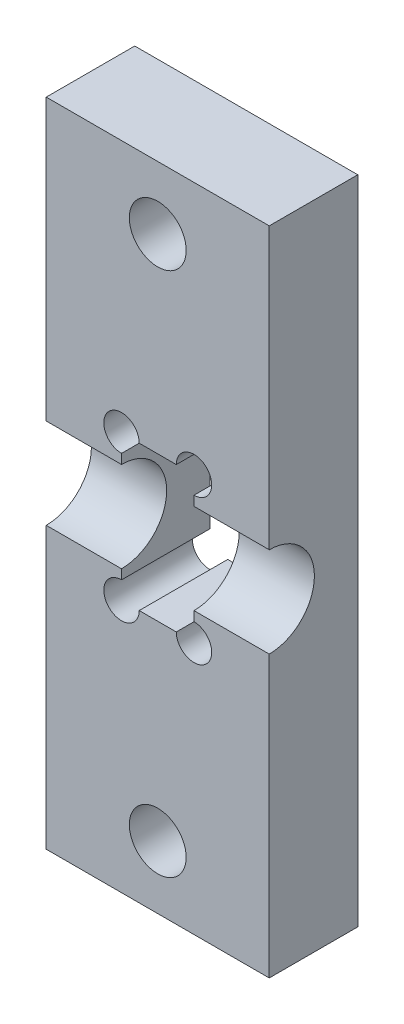
ISO-10303-21;
HEADER;
FILE_DESCRIPTION(('STEP AP214'),'2;1');
FILE_NAME('part.step','',(''),(''),'','','');
FILE_SCHEMA(('AUTOMOTIVE_DESIGN { 1 0 10303 214 1 1 1 1 }'));
ENDSEC;
DATA;
#1=APPLICATION_CONTEXT('core data for automotive mechanical design processes');
#2=APPLICATION_PROTOCOL_DEFINITION('international standard','automotive_design',2000,#1);
#3=PRODUCT_CONTEXT('',#1,'mechanical');
#4=PRODUCT('Part','Part','',(#3));
#5=PRODUCT_RELATED_PRODUCT_CATEGORY('part','',(#4));
#6=PRODUCT_DEFINITION_FORMATION('','',#4);
#7=PRODUCT_DEFINITION_CONTEXT('part definition',#1,'design');
#8=PRODUCT_DEFINITION('design','',#6,#7);
#9=PRODUCT_DEFINITION_SHAPE('','',#8);
#10=(LENGTH_UNIT() NAMED_UNIT(*) SI_UNIT(.MILLI.,.METRE.));
#11=(NAMED_UNIT(*) PLANE_ANGLE_UNIT() SI_UNIT($,.RADIAN.));
#12=(NAMED_UNIT(*) SI_UNIT($,.STERADIAN.) SOLID_ANGLE_UNIT());
#13=UNCERTAINTY_MEASURE_WITH_UNIT(LENGTH_MEASURE(1.E-05),#10,'distance_accuracy_value','');
#14=(GEOMETRIC_REPRESENTATION_CONTEXT(3) GLOBAL_UNCERTAINTY_ASSIGNED_CONTEXT((#13)) GLOBAL_UNIT_ASSIGNED_CONTEXT((#10,
#11,#12)) REPRESENTATION_CONTEXT('',''));
#15=CARTESIAN_POINT('',(0.,0.,0.));
#16=DIRECTION('',(0.,0.,1.));
#17=DIRECTION('',(1.,0.,0.));
#18=AXIS2_PLACEMENT_3D('',#15,#16,#17);
#19=CARTESIAN_POINT('',(0.,0.,7.9375));
#20=DIRECTION('',(0.,0.,-1.));
#21=DIRECTION('',(-1.,0.,0.));
#22=AXIS2_PLACEMENT_3D('',#19,#20,#21);
#23=PLANE('',#22);
#24=CARTESIAN_POINT('',(9.99999999999999,52.78,7.9375));
#25=DIRECTION('',(0.,0.,1.));
#26=DIRECTION('',(1.,0.,0.));
#27=AXIS2_PLACEMENT_3D('',#24,#25,#26);
#28=CIRCLE('',#27,2.54999999999999);
#29=CARTESIAN_POINT('',(12.55,52.78,7.9375));
#30=VERTEX_POINT('',#29);
#31=EDGE_CURVE('E183',#30,#30,#28,.T.);
#32=ORIENTED_EDGE('',*,*,#31,.F.);
#33=EDGE_LOOP('',(#32));
#34=FACE_BOUND('',#33,.T.);
#35=DIRECTION('',(0.,-1.,0.));
#36=VECTOR('',#35,1.);
#37=CARTESIAN_POINT('',(0.,0.,7.9375));
#38=LINE('',#37,#36);
#39=CARTESIAN_POINT('',(0.,58.42,7.9375));
#40=VERTEX_POINT('',#39);
#41=CARTESIAN_POINT('',(0.,33.26,7.9375));
#42=VERTEX_POINT('',#41);
#43=EDGE_CURVE('E157',#40,#42,#38,.T.);
#44=ORIENTED_EDGE('',*,*,#43,.T.);
#45=DIRECTION('',(1.,0.,0.));
#46=VECTOR('',#45,1.);
#47=CARTESIAN_POINT('',(0.,33.26,7.9375));
#48=LINE('',#47,#46);
#49=CARTESIAN_POINT('',(6.74999999999999,33.26,7.9375));
#50=VERTEX_POINT('',#49);
#51=EDGE_CURVE('E143',#42,#50,#48,.T.);
#52=ORIENTED_EDGE('',*,*,#51,.T.);
#53=DIRECTION('',(0.,-1.,0.));
#54=VECTOR('',#53,1.);
#55=CARTESIAN_POINT('',(6.74999999999999,34.1225,7.9375));
#56=LINE('',#55,#54);
#57=CARTESIAN_POINT('',(6.74999999999999,34.1225,7.9375));
#58=VERTEX_POINT('',#57);
#59=EDGE_CURVE('E301',#58,#50,#56,.T.);
#60=ORIENTED_EDGE('',*,*,#59,.F.);
#61=CARTESIAN_POINT('',(6.74999999999999,35.71,7.9375));
#62=DIRECTION('',(0.,0.,1.));
#63=DIRECTION('',(-1.,0.,0.));
#64=AXIS2_PLACEMENT_3D('',#61,#62,#63);
#65=CIRCLE('',#64,1.5875);
#66=CARTESIAN_POINT('',(8.33749999999999,35.71,7.9375));
#67=VERTEX_POINT('',#66);
#68=EDGE_CURVE('E304',#67,#58,#65,.T.);
#69=ORIENTED_EDGE('',*,*,#68,.F.);
#70=DIRECTION('',(-1.,0.,0.));
#71=VECTOR('',#70,1.);
#72=CARTESIAN_POINT('',(11.6625,35.71,7.9375));
#73=LINE('',#72,#71);
#74=CARTESIAN_POINT('',(11.6625,35.71,7.9375));
#75=VERTEX_POINT('',#74);
#76=EDGE_CURVE('E306',#75,#67,#73,.T.);
#77=ORIENTED_EDGE('',*,*,#76,.F.);
#78=CARTESIAN_POINT('',(13.25,35.71,7.9375));
#79=DIRECTION('',(0.,0.,1.));
#80=DIRECTION('',(1.,0.,0.));
#81=AXIS2_PLACEMENT_3D('',#78,#79,#80);
#82=CIRCLE('',#81,1.5875);
#83=CARTESIAN_POINT('',(13.25,34.1225,7.9375));
#84=VERTEX_POINT('',#83);
#85=EDGE_CURVE('E308',#84,#75,#82,.T.);
#86=ORIENTED_EDGE('',*,*,#85,.F.);
#87=DIRECTION('',(0.,1.,0.));
#88=VECTOR('',#87,1.);
#89=CARTESIAN_POINT('',(13.25,24.2975,7.9375));
#90=LINE('',#89,#88);
#91=CARTESIAN_POINT('',(13.25,33.26,7.9375));
#92=VERTEX_POINT('',#91);
#93=EDGE_CURVE('E313',#92,#84,#90,.T.);
#94=ORIENTED_EDGE('',*,*,#93,.F.);
#95=CARTESIAN_POINT('',(20.,33.26,7.9375));
#96=VERTEX_POINT('',#95);
#97=EDGE_CURVE('E48',#92,#96,#48,.T.);
#98=ORIENTED_EDGE('',*,*,#97,.T.);
#99=DIRECTION('',(0.,1.,0.));
#100=VECTOR('',#99,1.);
#101=CARTESIAN_POINT('',(20.,0.,7.9375));
#102=LINE('',#101,#100);
#103=CARTESIAN_POINT('',(20.,58.42,7.9375));
#104=VERTEX_POINT('',#103);
#105=EDGE_CURVE('E167',#96,#104,#102,.T.);
#106=ORIENTED_EDGE('',*,*,#105,.T.);
#107=DIRECTION('',(-1.,0.,0.));
#108=VECTOR('',#107,1.);
#109=CARTESIAN_POINT('',(0.,58.42,7.9375));
#110=LINE('',#109,#108);
#111=EDGE_CURVE('E163',#104,#40,#110,.T.);
#112=ORIENTED_EDGE('',*,*,#111,.T.);
#113=EDGE_LOOP('',(#44,#52,#60,#69,#77,#86,#94,#98,#106,#112));
#114=FACE_BOUND('',#113,.T.);
#115=ADVANCED_FACE('F33',(#34,#114),#23,.F.);
#116=CARTESIAN_POINT('',(10.,5.63999999999999,7.9375));
#117=DIRECTION('',(0.,0.,1.));
#118=DIRECTION('',(1.,0.,0.));
#119=AXIS2_PLACEMENT_3D('',#116,#117,#118);
#120=CIRCLE('',#119,2.55);
#121=CARTESIAN_POINT('',(12.55,5.63999999999999,7.9375));
#122=VERTEX_POINT('',#121);
#123=EDGE_CURVE('E242',#122,#122,#120,.T.);
#124=ORIENTED_EDGE('',*,*,#123,.F.);
#125=EDGE_LOOP('',(#124));
#126=FACE_BOUND('',#125,.T.);
#127=CARTESIAN_POINT('',(20.,0.,7.9375));
#128=VERTEX_POINT('',#127);
#129=CARTESIAN_POINT('',(20.,25.16,7.9375));
#130=VERTEX_POINT('',#129);
#131=EDGE_CURVE('E174',#128,#130,#102,.T.);
#132=ORIENTED_EDGE('',*,*,#131,.T.);
#133=DIRECTION('',(1.,0.,0.));
#134=VECTOR('',#133,1.);
#135=CARTESIAN_POINT('',(0.,25.16,7.9375));
#136=LINE('',#135,#134);
#137=CARTESIAN_POINT('',(13.25,25.16,7.9375));
#138=VERTEX_POINT('',#137);
#139=EDGE_CURVE('E151',#138,#130,#136,.T.);
#140=ORIENTED_EDGE('',*,*,#139,.F.);
#141=CARTESIAN_POINT('',(13.25,24.2975,7.9375));
#142=VERTEX_POINT('',#141);
#143=EDGE_CURVE('E310',#142,#138,#90,.T.);
#144=ORIENTED_EDGE('',*,*,#143,.F.);
#145=CARTESIAN_POINT('',(13.25,22.71,7.9375));
#146=DIRECTION('',(0.,0.,1.));
#147=DIRECTION('',(-1.,0.,0.));
#148=AXIS2_PLACEMENT_3D('',#145,#146,#147);
#149=CIRCLE('',#148,1.5875);
#150=CARTESIAN_POINT('',(11.6625,22.71,7.9375));
#151=VERTEX_POINT('',#150);
#152=EDGE_CURVE('E274',#151,#142,#149,.T.);
#153=ORIENTED_EDGE('',*,*,#152,.F.);
#154=DIRECTION('',(1.,0.,0.));
#155=VECTOR('',#154,1.);
#156=CARTESIAN_POINT('',(8.3375,22.71,7.9375));
#157=LINE('',#156,#155);
#158=CARTESIAN_POINT('',(8.33749999999999,22.71,7.9375));
#159=VERTEX_POINT('',#158);
#160=EDGE_CURVE('E270',#159,#151,#157,.T.);
#161=ORIENTED_EDGE('',*,*,#160,.F.);
#162=CARTESIAN_POINT('',(6.74999999999999,22.71,7.9375));
#163=DIRECTION('',(0.,0.,1.));
#164=DIRECTION('',(-1.,0.,0.));
#165=AXIS2_PLACEMENT_3D('',#162,#163,#164);
#166=CIRCLE('',#165,1.5875);
#167=CARTESIAN_POINT('',(6.74999999999999,24.2975,7.9375));
#168=VERTEX_POINT('',#167);
#169=EDGE_CURVE('E298',#168,#159,#166,.T.);
#170=ORIENTED_EDGE('',*,*,#169,.F.);
#171=CARTESIAN_POINT('',(6.74999999999999,25.16,7.9375));
#172=VERTEX_POINT('',#171);
#173=EDGE_CURVE('E303',#172,#168,#56,.T.);
#174=ORIENTED_EDGE('',*,*,#173,.F.);
#175=CARTESIAN_POINT('',(0.,25.16,7.9375));
#176=VERTEX_POINT('',#175);
#177=EDGE_CURVE('E55',#176,#172,#136,.T.);
#178=ORIENTED_EDGE('',*,*,#177,.F.);
#179=CARTESIAN_POINT('',(0.,0.,7.9375));
#180=VERTEX_POINT('',#179);
#181=EDGE_CURVE('E159',#176,#180,#38,.T.);
#182=ORIENTED_EDGE('',*,*,#181,.T.);
#183=DIRECTION('',(1.,0.,0.));
#184=VECTOR('',#183,1.);
#185=CARTESIAN_POINT('',(0.,0.,7.9375));
#186=LINE('',#185,#184);
#187=EDGE_CURVE('E165',#180,#128,#186,.T.);
#188=ORIENTED_EDGE('',*,*,#187,.T.);
#189=EDGE_LOOP('',(#132,#140,#144,#153,#161,#170,#174,#178,#182,#188));
#190=FACE_BOUND('',#189,.T.);
#191=ADVANCED_FACE('F225',(#126,#190),#23,.F.);
#192=CARTESIAN_POINT('',(0.,0.,0.));
#193=DIRECTION('',(0.,0.,-1.));
#194=DIRECTION('',(-1.,0.,0.));
#195=AXIS2_PLACEMENT_3D('',#192,#193,#194);
#196=PLANE('',#195);
#197=CARTESIAN_POINT('',(9.99999999999999,52.78,0.));
#198=DIRECTION('',(0.,0.,1.));
#199=DIRECTION('',(1.,0.,0.));
#200=AXIS2_PLACEMENT_3D('',#197,#198,#199);
#201=CIRCLE('',#200,2.54999999999999);
#202=CARTESIAN_POINT('',(12.55,52.78,0.));
#203=VERTEX_POINT('',#202);
#204=EDGE_CURVE('E171',#203,#203,#201,.T.);
#205=ORIENTED_EDGE('',*,*,#204,.T.);
#206=EDGE_LOOP('',(#205));
#207=FACE_BOUND('',#206,.T.);
#208=DIRECTION('',(0.,-1.,0.));
#209=VECTOR('',#208,1.);
#210=CARTESIAN_POINT('',(0.,0.,0.));
#211=LINE('',#210,#209);
#212=CARTESIAN_POINT('',(0.,58.42,0.));
#213=VERTEX_POINT('',#212);
#214=CARTESIAN_POINT('',(0.,0.,0.));
#215=VERTEX_POINT('',#214);
#216=EDGE_CURVE('E179',#213,#215,#211,.T.);
#217=ORIENTED_EDGE('',*,*,#216,.F.);
#218=DIRECTION('',(-1.,0.,0.));
#219=VECTOR('',#218,1.);
#220=CARTESIAN_POINT('',(0.,58.42,0.));
#221=LINE('',#220,#219);
#222=CARTESIAN_POINT('',(20.,58.42,0.));
#223=VERTEX_POINT('',#222);
#224=EDGE_CURVE('E169',#223,#213,#221,.T.);
#225=ORIENTED_EDGE('',*,*,#224,.F.);
#226=DIRECTION('',(0.,1.,0.));
#227=VECTOR('',#226,1.);
#228=CARTESIAN_POINT('',(20.,0.,0.));
#229=LINE('',#228,#227);
#230=CARTESIAN_POINT('',(20.,0.,0.));
#231=VERTEX_POINT('',#230);
#232=EDGE_CURVE('E185',#231,#223,#229,.T.);
#233=ORIENTED_EDGE('',*,*,#232,.F.);
#234=DIRECTION('',(1.,0.,0.));
#235=VECTOR('',#234,1.);
#236=CARTESIAN_POINT('',(0.,0.,0.));
#237=LINE('',#236,#235);
#238=EDGE_CURVE('E182',#215,#231,#237,.T.);
#239=ORIENTED_EDGE('',*,*,#238,.F.);
#240=EDGE_LOOP('',(#217,#225,#233,#239));
#241=FACE_BOUND('',#240,.T.);
#242=CARTESIAN_POINT('',(10.,5.63999999999999,0.));
#243=DIRECTION('',(0.,0.,1.));
#244=DIRECTION('',(1.,0.,0.));
#245=AXIS2_PLACEMENT_3D('',#242,#243,#244);
#246=CIRCLE('',#245,2.55);
#247=CARTESIAN_POINT('',(12.55,5.63999999999999,0.));
#248=VERTEX_POINT('',#247);
#249=EDGE_CURVE('E245',#248,#248,#246,.T.);
#250=ORIENTED_EDGE('',*,*,#249,.T.);
#251=EDGE_LOOP('',(#250));
#252=FACE_BOUND('',#251,.T.);
#253=DIRECTION('',(1.,0.,0.));
#254=VECTOR('',#253,1.);
#255=CARTESIAN_POINT('',(8.3375,22.71,0.));
#256=LINE('',#255,#254);
#257=CARTESIAN_POINT('',(8.33749999999999,22.71,0.));
#258=VERTEX_POINT('',#257);
#259=CARTESIAN_POINT('',(11.6625,22.71,0.));
#260=VERTEX_POINT('',#259);
#261=EDGE_CURVE('E271',#258,#260,#256,.T.);
#262=ORIENTED_EDGE('',*,*,#261,.T.);
#263=CARTESIAN_POINT('',(13.25,22.71,0.));
#264=DIRECTION('',(0.,0.,1.));
#265=DIRECTION('',(-1.,0.,0.));
#266=AXIS2_PLACEMENT_3D('',#263,#264,#265);
#267=CIRCLE('',#266,1.5875);
#268=CARTESIAN_POINT('',(13.25,24.2975,0.));
#269=VERTEX_POINT('',#268);
#270=EDGE_CURVE('E293',#260,#269,#267,.T.);
#271=ORIENTED_EDGE('',*,*,#270,.T.);
#272=DIRECTION('',(0.,1.,0.));
#273=VECTOR('',#272,1.);
#274=CARTESIAN_POINT('',(13.25,24.2975,0.));
#275=LINE('',#274,#273);
#276=CARTESIAN_POINT('',(13.25,34.1225,0.));
#277=VERTEX_POINT('',#276);
#278=EDGE_CURVE('E290',#269,#277,#275,.T.);
#279=ORIENTED_EDGE('',*,*,#278,.T.);
#280=CARTESIAN_POINT('',(13.25,35.71,0.));
#281=DIRECTION('',(0.,0.,1.));
#282=DIRECTION('',(1.,0.,0.));
#283=AXIS2_PLACEMENT_3D('',#280,#281,#282);
#284=CIRCLE('',#283,1.5875);
#285=CARTESIAN_POINT('',(11.6625,35.71,0.));
#286=VERTEX_POINT('',#285);
#287=EDGE_CURVE('E287',#277,#286,#284,.T.);
#288=ORIENTED_EDGE('',*,*,#287,.T.);
#289=DIRECTION('',(-1.,0.,0.));
#290=VECTOR('',#289,1.);
#291=CARTESIAN_POINT('',(11.6625,35.71,0.));
#292=LINE('',#291,#290);
#293=CARTESIAN_POINT('',(8.33749999999999,35.71,0.));
#294=VERTEX_POINT('',#293);
#295=EDGE_CURVE('E284',#286,#294,#292,.T.);
#296=ORIENTED_EDGE('',*,*,#295,.T.);
#297=CARTESIAN_POINT('',(6.74999999999999,35.71,0.));
#298=DIRECTION('',(0.,0.,1.));
#299=DIRECTION('',(-1.,0.,0.));
#300=AXIS2_PLACEMENT_3D('',#297,#298,#299);
#301=CIRCLE('',#300,1.5875);
#302=CARTESIAN_POINT('',(6.74999999999999,34.1225,0.));
#303=VERTEX_POINT('',#302);
#304=EDGE_CURVE('E281',#294,#303,#301,.T.);
#305=ORIENTED_EDGE('',*,*,#304,.T.);
#306=DIRECTION('',(0.,-1.,0.));
#307=VECTOR('',#306,1.);
#308=CARTESIAN_POINT('',(6.74999999999999,34.1225,0.));
#309=LINE('',#308,#307);
#310=CARTESIAN_POINT('',(6.74999999999999,24.2975,0.));
#311=VERTEX_POINT('',#310);
#312=EDGE_CURVE('E278',#303,#311,#309,.T.);
#313=ORIENTED_EDGE('',*,*,#312,.T.);
#314=CARTESIAN_POINT('',(6.74999999999999,22.71,0.));
#315=DIRECTION('',(0.,0.,1.));
#316=DIRECTION('',(-1.,0.,0.));
#317=AXIS2_PLACEMENT_3D('',#314,#315,#316);
#318=CIRCLE('',#317,1.5875);
#319=EDGE_CURVE('E275',#311,#258,#318,.T.);
#320=ORIENTED_EDGE('',*,*,#319,.T.);
#321=EDGE_LOOP('',(#262,#271,#279,#288,#296,#305,#313,#320));
#322=FACE_BOUND('',#321,.T.);
#323=ADVANCED_FACE('F202',(#207,#241,#252,#322),#196,.T.);
#324=CARTESIAN_POINT('',(0.,0.,7.9375));
#325=DIRECTION('',(1.,0.,0.));
#326=DIRECTION('',(0.,1.,0.));
#327=AXIS2_PLACEMENT_3D('',#324,#325,#326);
#328=PLANE('',#327);
#329=ORIENTED_EDGE('',*,*,#181,.F.);
#330=CARTESIAN_POINT('',(0.,29.21,7.9375));
#331=DIRECTION('',(1.,0.,0.));
#332=DIRECTION('',(0.,1.,0.));
#333=AXIS2_PLACEMENT_3D('',#330,#331,#332);
#334=CIRCLE('',#333,4.05);
#335=EDGE_CURVE('E146',#176,#42,#334,.T.);
#336=ORIENTED_EDGE('',*,*,#335,.T.);
#337=ORIENTED_EDGE('',*,*,#43,.F.);
#338=DIRECTION('',(0.,0.,-1.));
#339=VECTOR('',#338,1.);
#340=CARTESIAN_POINT('',(0.,58.42,7.9375));
#341=LINE('',#340,#339);
#342=EDGE_CURVE('E178',#40,#213,#341,.T.);
#343=ORIENTED_EDGE('',*,*,#342,.T.);
#344=ORIENTED_EDGE('',*,*,#216,.T.);
#345=DIRECTION('',(0.,0.,-1.));
#346=VECTOR('',#345,1.);
#347=CARTESIAN_POINT('',(0.,0.,7.9375));
#348=LINE('',#347,#346);
#349=EDGE_CURVE('E41',#180,#215,#348,.T.);
#350=ORIENTED_EDGE('',*,*,#349,.F.);
#351=EDGE_LOOP('',(#329,#336,#337,#343,#344,#350));
#352=FACE_BOUND('',#351,.T.);
#353=ADVANCED_FACE('F35',(#352),#328,.F.);
#354=CARTESIAN_POINT('',(0.,0.,7.9375));
#355=DIRECTION('',(0.,1.,0.));
#356=DIRECTION('',(-1.,0.,0.));
#357=AXIS2_PLACEMENT_3D('',#354,#355,#356);
#358=PLANE('',#357);
#359=ORIENTED_EDGE('',*,*,#238,.T.);
#360=DIRECTION('',(0.,0.,-1.));
#361=VECTOR('',#360,1.);
#362=CARTESIAN_POINT('',(20.,0.,7.9375));
#363=LINE('',#362,#361);
#364=EDGE_CURVE('E192',#128,#231,#363,.T.);
#365=ORIENTED_EDGE('',*,*,#364,.F.);
#366=ORIENTED_EDGE('',*,*,#187,.F.);
#367=ORIENTED_EDGE('',*,*,#349,.T.);
#368=EDGE_LOOP('',(#359,#365,#366,#367));
#369=FACE_BOUND('',#368,.T.);
#370=ADVANCED_FACE('F197',(#369),#358,.F.);
#371=CARTESIAN_POINT('',(20.,0.,7.9375));
#372=DIRECTION('',(-1.,0.,0.));
#373=DIRECTION('',(0.,-1.,0.));
#374=AXIS2_PLACEMENT_3D('',#371,#372,#373);
#375=PLANE('',#374);
#376=ORIENTED_EDGE('',*,*,#105,.F.);
#377=CARTESIAN_POINT('',(20.,29.21,7.9375));
#378=DIRECTION('',(1.,0.,0.));
#379=DIRECTION('',(0.,1.,0.));
#380=AXIS2_PLACEMENT_3D('',#377,#378,#379);
#381=CIRCLE('',#380,4.05);
#382=EDGE_CURVE('E160',#130,#96,#381,.T.);
#383=ORIENTED_EDGE('',*,*,#382,.F.);
#384=ORIENTED_EDGE('',*,*,#131,.F.);
#385=ORIENTED_EDGE('',*,*,#364,.T.);
#386=ORIENTED_EDGE('',*,*,#232,.T.);
#387=DIRECTION('',(0.,0.,-1.));
#388=VECTOR('',#387,1.);
#389=CARTESIAN_POINT('',(20.,58.42,7.9375));
#390=LINE('',#389,#388);
#391=EDGE_CURVE('E189',#104,#223,#390,.T.);
#392=ORIENTED_EDGE('',*,*,#391,.F.);
#393=EDGE_LOOP('',(#376,#383,#384,#385,#386,#392));
#394=FACE_BOUND('',#393,.T.);
#395=ADVANCED_FACE('F208',(#394),#375,.F.);
#396=CARTESIAN_POINT('',(0.,58.42,7.9375));
#397=DIRECTION('',(0.,-1.,0.));
#398=DIRECTION('',(1.,0.,0.));
#399=AXIS2_PLACEMENT_3D('',#396,#397,#398);
#400=PLANE('',#399);
#401=ORIENTED_EDGE('',*,*,#224,.T.);
#402=ORIENTED_EDGE('',*,*,#342,.F.);
#403=ORIENTED_EDGE('',*,*,#111,.F.);
#404=ORIENTED_EDGE('',*,*,#391,.T.);
#405=EDGE_LOOP('',(#401,#402,#403,#404));
#406=FACE_BOUND('',#405,.T.);
#407=ADVANCED_FACE('F211',(#406),#400,.F.);
#408=CARTESIAN_POINT('',(9.99999999999999,52.78,7.9375));
#409=DIRECTION('',(0.,0.,-1.));
#410=DIRECTION('',(-1.,0.,0.));
#411=AXIS2_PLACEMENT_3D('',#408,#409,#410);
#412=CYLINDRICAL_SURFACE('',#411,2.54999999999999);
#413=ORIENTED_EDGE('',*,*,#31,.T.);
#414=EDGE_LOOP('',(#413));
#415=FACE_BOUND('',#414,.T.);
#416=ORIENTED_EDGE('',*,*,#204,.F.);
#417=EDGE_LOOP('',(#416));
#418=FACE_BOUND('',#417,.T.);
#419=ADVANCED_FACE('F213',(#415,#418),#412,.F.);
#420=CARTESIAN_POINT('',(10.,5.63999999999999,7.9375));
#421=DIRECTION('',(0.,0.,-1.));
#422=DIRECTION('',(-1.,0.,0.));
#423=AXIS2_PLACEMENT_3D('',#420,#421,#422);
#424=CYLINDRICAL_SURFACE('',#423,2.55);
#425=ORIENTED_EDGE('',*,*,#123,.T.);
#426=EDGE_LOOP('',(#425));
#427=FACE_BOUND('',#426,.T.);
#428=ORIENTED_EDGE('',*,*,#249,.F.);
#429=EDGE_LOOP('',(#428));
#430=FACE_BOUND('',#429,.T.);
#431=ADVANCED_FACE('F219',(#427,#430),#424,.F.);
#432=CARTESIAN_POINT('',(13.25,22.71,7.9375));
#433=DIRECTION('',(0.,0.,-1.));
#434=DIRECTION('',(-1.,0.,0.));
#435=AXIS2_PLACEMENT_3D('',#432,#433,#434);
#436=CYLINDRICAL_SURFACE('',#435,1.5875);
#437=ORIENTED_EDGE('',*,*,#270,.F.);
#438=DIRECTION('',(0.,0.,-1.));
#439=VECTOR('',#438,1.);
#440=CARTESIAN_POINT('',(11.6625,22.71,7.9375));
#441=LINE('',#440,#439);
#442=EDGE_CURVE('E267',#151,#260,#441,.T.);
#443=ORIENTED_EDGE('',*,*,#442,.F.);
#444=ORIENTED_EDGE('',*,*,#152,.T.);
#445=DIRECTION('',(0.,0.,-1.));
#446=VECTOR('',#445,1.);
#447=CARTESIAN_POINT('',(13.25,24.2975,7.9375));
#448=LINE('',#447,#446);
#449=EDGE_CURVE('E250',#142,#269,#448,.T.);
#450=ORIENTED_EDGE('',*,*,#449,.T.);
#451=EDGE_LOOP('',(#437,#443,#444,#450));
#452=FACE_BOUND('',#451,.T.);
#453=ADVANCED_FACE('F335',(#452),#436,.F.);
#454=CARTESIAN_POINT('',(13.25,24.2975,7.9375));
#455=DIRECTION('',(-1.,0.,0.));
#456=DIRECTION('',(0.,0.,1.));
#457=AXIS2_PLACEMENT_3D('',#454,#455,#456);
#458=PLANE('',#457);
#459=CARTESIAN_POINT('',(13.25,29.21,7.9375));
#460=DIRECTION('',(-1.,0.,0.));
#461=DIRECTION('',(0.,0.,1.));
#462=AXIS2_PLACEMENT_3D('',#459,#460,#461);
#463=CIRCLE('',#462,4.05);
#464=EDGE_CURVE('E296',#92,#138,#463,.T.);
#465=ORIENTED_EDGE('',*,*,#464,.F.);
#466=ORIENTED_EDGE('',*,*,#93,.T.);
#467=DIRECTION('',(0.,0.,-1.));
#468=VECTOR('',#467,1.);
#469=CARTESIAN_POINT('',(13.25,34.1225,7.9375));
#470=LINE('',#469,#468);
#471=EDGE_CURVE('E255',#84,#277,#470,.T.);
#472=ORIENTED_EDGE('',*,*,#471,.T.);
#473=ORIENTED_EDGE('',*,*,#278,.F.);
#474=ORIENTED_EDGE('',*,*,#449,.F.);
#475=ORIENTED_EDGE('',*,*,#143,.T.);
#476=EDGE_LOOP('',(#465,#466,#472,#473,#474,#475));
#477=FACE_BOUND('',#476,.T.);
#478=ADVANCED_FACE('F325',(#477),#458,.T.);
#479=CARTESIAN_POINT('',(13.25,35.71,7.9375));
#480=DIRECTION('',(0.,0.,-1.));
#481=DIRECTION('',(-1.,0.,0.));
#482=AXIS2_PLACEMENT_3D('',#479,#480,#481);
#483=CYLINDRICAL_SURFACE('',#482,1.5875);
#484=ORIENTED_EDGE('',*,*,#287,.F.);
#485=ORIENTED_EDGE('',*,*,#471,.F.);
#486=ORIENTED_EDGE('',*,*,#85,.T.);
#487=DIRECTION('',(0.,0.,-1.));
#488=VECTOR('',#487,1.);
#489=CARTESIAN_POINT('',(11.6625,35.71,7.9375));
#490=LINE('',#489,#488);
#491=EDGE_CURVE('E257',#75,#286,#490,.T.);
#492=ORIENTED_EDGE('',*,*,#491,.T.);
#493=EDGE_LOOP('',(#484,#485,#486,#492));
#494=FACE_BOUND('',#493,.T.);
#495=ADVANCED_FACE('F328',(#494),#483,.F.);
#496=CARTESIAN_POINT('',(11.6625,35.71,7.9375));
#497=DIRECTION('',(0.,-1.,0.));
#498=DIRECTION('',(0.,0.,-1.));
#499=AXIS2_PLACEMENT_3D('',#496,#497,#498);
#500=PLANE('',#499);
#501=ORIENTED_EDGE('',*,*,#295,.F.);
#502=ORIENTED_EDGE('',*,*,#491,.F.);
#503=ORIENTED_EDGE('',*,*,#76,.T.);
#504=DIRECTION('',(0.,0.,-1.));
#505=VECTOR('',#504,1.);
#506=CARTESIAN_POINT('',(8.33749999999999,35.71,7.9375));
#507=LINE('',#506,#505);
#508=EDGE_CURVE('E259',#67,#294,#507,.T.);
#509=ORIENTED_EDGE('',*,*,#508,.T.);
#510=EDGE_LOOP('',(#501,#502,#503,#509));
#511=FACE_BOUND('',#510,.T.);
#512=ADVANCED_FACE('F357',(#511),#500,.T.);
#513=CARTESIAN_POINT('',(6.74999999999999,35.71,7.9375));
#514=DIRECTION('',(0.,0.,-1.));
#515=DIRECTION('',(-1.,0.,0.));
#516=AXIS2_PLACEMENT_3D('',#513,#514,#515);
#517=CYLINDRICAL_SURFACE('',#516,1.5875);
#518=ORIENTED_EDGE('',*,*,#304,.F.);
#519=ORIENTED_EDGE('',*,*,#508,.F.);
#520=ORIENTED_EDGE('',*,*,#68,.T.);
#521=DIRECTION('',(0.,0.,-1.));
#522=VECTOR('',#521,1.);
#523=CARTESIAN_POINT('',(6.74999999999999,34.1225,7.9375));
#524=LINE('',#523,#522);
#525=EDGE_CURVE('E261',#58,#303,#524,.T.);
#526=ORIENTED_EDGE('',*,*,#525,.T.);
#527=EDGE_LOOP('',(#518,#519,#520,#526));
#528=FACE_BOUND('',#527,.T.);
#529=ADVANCED_FACE('F355',(#528),#517,.F.);
#530=CARTESIAN_POINT('',(6.74999999999999,34.1225,7.9375));
#531=DIRECTION('',(1.,0.,0.));
#532=DIRECTION('',(0.,1.,0.));
#533=AXIS2_PLACEMENT_3D('',#530,#531,#532);
#534=PLANE('',#533);
#535=CARTESIAN_POINT('',(6.74999999999999,29.21,7.9375));
#536=DIRECTION('',(1.,0.,0.));
#537=DIRECTION('',(0.,1.,0.));
#538=AXIS2_PLACEMENT_3D('',#535,#536,#537);
#539=CIRCLE('',#538,4.05);
#540=EDGE_CURVE('E11',#172,#50,#539,.T.);
#541=ORIENTED_EDGE('',*,*,#540,.F.);
#542=ORIENTED_EDGE('',*,*,#173,.T.);
#543=DIRECTION('',(0.,0.,-1.));
#544=VECTOR('',#543,1.);
#545=CARTESIAN_POINT('',(6.74999999999999,24.2975,7.9375));
#546=LINE('',#545,#544);
#547=EDGE_CURVE('E263',#168,#311,#546,.T.);
#548=ORIENTED_EDGE('',*,*,#547,.T.);
#549=ORIENTED_EDGE('',*,*,#312,.F.);
#550=ORIENTED_EDGE('',*,*,#525,.F.);
#551=ORIENTED_EDGE('',*,*,#59,.T.);
#552=EDGE_LOOP('',(#541,#542,#548,#549,#550,#551));
#553=FACE_BOUND('',#552,.T.);
#554=ADVANCED_FACE('F344',(#553),#534,.T.);
#555=CARTESIAN_POINT('',(6.74999999999999,22.71,7.9375));
#556=DIRECTION('',(0.,0.,-1.));
#557=DIRECTION('',(-1.,0.,0.));
#558=AXIS2_PLACEMENT_3D('',#555,#556,#557);
#559=CYLINDRICAL_SURFACE('',#558,1.5875);
#560=ORIENTED_EDGE('',*,*,#319,.F.);
#561=ORIENTED_EDGE('',*,*,#547,.F.);
#562=ORIENTED_EDGE('',*,*,#169,.T.);
#563=DIRECTION('',(0.,0.,-1.));
#564=VECTOR('',#563,1.);
#565=CARTESIAN_POINT('',(8.33749999999999,22.71,7.9375));
#566=LINE('',#565,#564);
#567=EDGE_CURVE('E265',#159,#258,#566,.T.);
#568=ORIENTED_EDGE('',*,*,#567,.T.);
#569=EDGE_LOOP('',(#560,#561,#562,#568));
#570=FACE_BOUND('',#569,.T.);
#571=ADVANCED_FACE('F348',(#570),#559,.F.);
#572=CARTESIAN_POINT('',(8.3375,22.71,7.9375));
#573=DIRECTION('',(0.,1.,0.));
#574=DIRECTION('',(0.,0.,1.));
#575=AXIS2_PLACEMENT_3D('',#572,#573,#574);
#576=PLANE('',#575);
#577=ORIENTED_EDGE('',*,*,#261,.F.);
#578=ORIENTED_EDGE('',*,*,#567,.F.);
#579=ORIENTED_EDGE('',*,*,#160,.T.);
#580=ORIENTED_EDGE('',*,*,#442,.T.);
#581=EDGE_LOOP('',(#577,#578,#579,#580));
#582=FACE_BOUND('',#581,.T.);
#583=ADVANCED_FACE('F413',(#582),#576,.T.);
#584=CARTESIAN_POINT('',(0.,29.21,7.9375));
#585=DIRECTION('',(1.,0.,0.));
#586=DIRECTION('',(0.,1.,0.));
#587=AXIS2_PLACEMENT_3D('',#584,#585,#586);
#588=CYLINDRICAL_SURFACE('',#587,4.05);
#589=ORIENTED_EDGE('',*,*,#540,.T.);
#590=ORIENTED_EDGE('',*,*,#51,.F.);
#591=ORIENTED_EDGE('',*,*,#335,.F.);
#592=ORIENTED_EDGE('',*,*,#177,.T.);
#593=EDGE_LOOP('',(#589,#590,#591,#592));
#594=FACE_BOUND('',#593,.T.);
#595=ADVANCED_FACE('F145',(#594),#588,.F.);
#596=ORIENTED_EDGE('',*,*,#464,.T.);
#597=ORIENTED_EDGE('',*,*,#139,.T.);
#598=ORIENTED_EDGE('',*,*,#382,.T.);
#599=ORIENTED_EDGE('',*,*,#97,.F.);
#600=EDGE_LOOP('',(#596,#597,#598,#599));
#601=FACE_BOUND('',#600,.T.);
#602=ADVANCED_FACE('F318',(#601),#588,.F.);
#603=CLOSED_SHELL('',(#115,#191,#323,#353,#370,#395,#407,#419,#431,#453,#478,#495,#512,#529,
#554,#571,#583,#595,#602));
#604=MANIFOLD_SOLID_BREP('B2',#603);
#605=ADVANCED_BREP_SHAPE_REPRESENTATION('',(#18,#604),#14);
#606=SHAPE_DEFINITION_REPRESENTATION(#9,#605);
ENDSEC;
END-ISO-10303-21;
